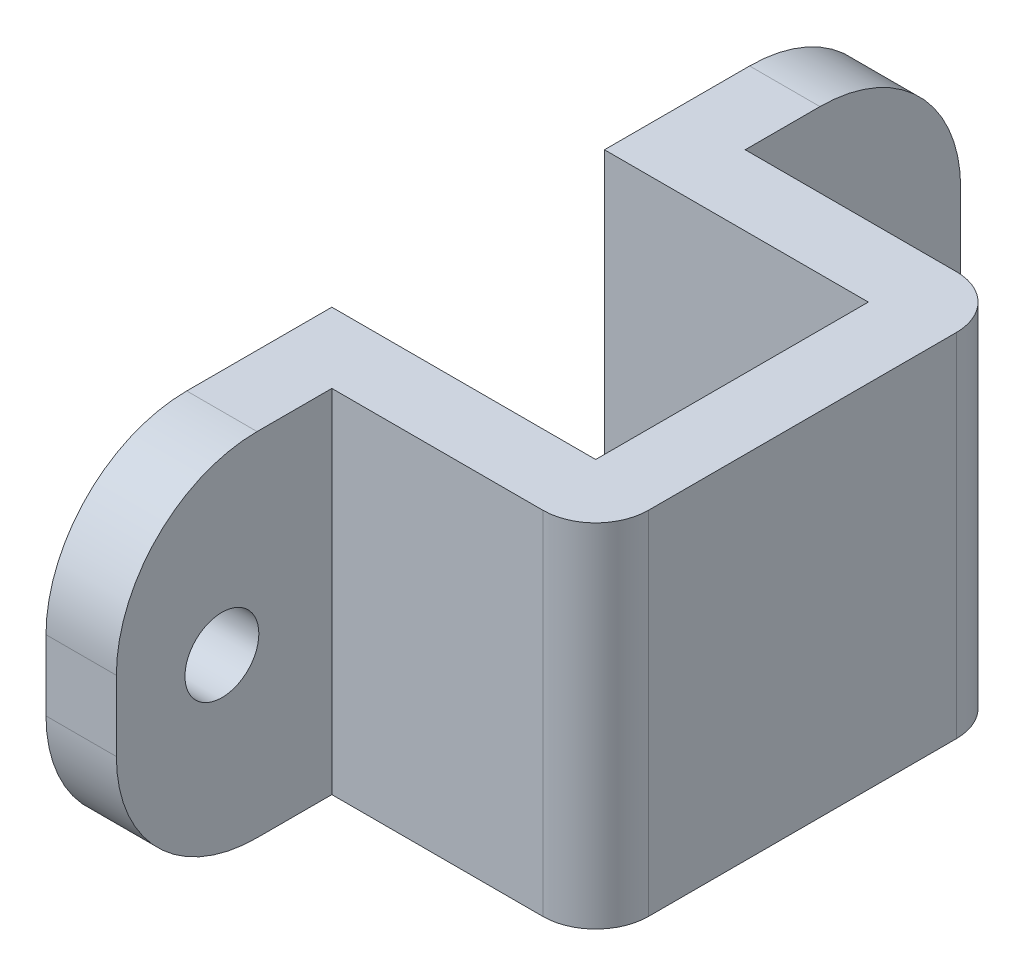
ISO-10303-21;
HEADER;
FILE_DESCRIPTION(('STEP AP214'),'2;1');
FILE_NAME('part.step','',(''),(''),'','','');
FILE_SCHEMA(('AUTOMOTIVE_DESIGN { 1 0 10303 214 1 1 1 1 }'));
ENDSEC;
DATA;
#1=APPLICATION_CONTEXT('core data for automotive mechanical design processes');
#2=APPLICATION_PROTOCOL_DEFINITION('international standard','automotive_design',2000,#1);
#3=PRODUCT_CONTEXT('',#1,'mechanical');
#4=PRODUCT('Part','Part','',(#3));
#5=PRODUCT_RELATED_PRODUCT_CATEGORY('part','',(#4));
#6=PRODUCT_DEFINITION_FORMATION('','',#4);
#7=PRODUCT_DEFINITION_CONTEXT('part definition',#1,'design');
#8=PRODUCT_DEFINITION('design','',#6,#7);
#9=PRODUCT_DEFINITION_SHAPE('','',#8);
#10=(LENGTH_UNIT() NAMED_UNIT(*) SI_UNIT(.MILLI.,.METRE.));
#11=(NAMED_UNIT(*) PLANE_ANGLE_UNIT() SI_UNIT($,.RADIAN.));
#12=(NAMED_UNIT(*) SI_UNIT($,.STERADIAN.) SOLID_ANGLE_UNIT());
#13=UNCERTAINTY_MEASURE_WITH_UNIT(LENGTH_MEASURE(1.E-05),#10,'distance_accuracy_value','');
#14=(GEOMETRIC_REPRESENTATION_CONTEXT(3) GLOBAL_UNCERTAINTY_ASSIGNED_CONTEXT((#13)) GLOBAL_UNIT_ASSIGNED_CONTEXT((#10,
#11,#12)) REPRESENTATION_CONTEXT('',''));
#15=CARTESIAN_POINT('',(0.,0.,0.));
#16=DIRECTION('',(0.,0.,1.));
#17=DIRECTION('',(1.,0.,0.));
#18=AXIS2_PLACEMENT_3D('',#15,#16,#17);
#19=CARTESIAN_POINT('',(0.,20.,-7.75));
#20=DIRECTION('',(0.,0.,-1.));
#21=DIRECTION('',(-1.,0.,0.));
#22=AXIS2_PLACEMENT_3D('',#19,#20,#21);
#23=PLANE('',#22);
#24=DIRECTION('',(1.,0.,0.));
#25=VECTOR('',#24,1.);
#26=CARTESIAN_POINT('',(0.,0.,-7.75));
#27=LINE('',#26,#25);
#28=CARTESIAN_POINT('',(-15.,0.,-7.75));
#29=VERTEX_POINT('',#28);
#30=CARTESIAN_POINT('',(0.,0.,-7.75));
#31=VERTEX_POINT('',#30);
#32=EDGE_CURVE('E188',#29,#31,#27,.T.);
#33=ORIENTED_EDGE('',*,*,#32,.T.);
#34=DIRECTION('',(0.,-1.,0.));
#35=VECTOR('',#34,1.);
#36=CARTESIAN_POINT('',(0.,20.,-7.75));
#37=LINE('',#36,#35);
#38=CARTESIAN_POINT('',(0.,20.,-7.75));
#39=VERTEX_POINT('',#38);
#40=EDGE_CURVE('E186',#39,#31,#37,.T.);
#41=ORIENTED_EDGE('',*,*,#40,.F.);
#42=DIRECTION('',(1.,0.,0.));
#43=VECTOR('',#42,1.);
#44=CARTESIAN_POINT('',(-11.,20.,-7.75));
#45=LINE('',#44,#43);
#46=CARTESIAN_POINT('',(-15.,20.,-7.75));
#47=VERTEX_POINT('',#46);
#48=EDGE_CURVE('E170',#47,#39,#45,.T.);
#49=ORIENTED_EDGE('',*,*,#48,.F.);
#50=DIRECTION('',(0.,-1.,0.));
#51=VECTOR('',#50,1.);
#52=CARTESIAN_POINT('',(-15.,20.,-7.75));
#53=LINE('',#52,#51);
#54=EDGE_CURVE('E228',#47,#29,#53,.T.);
#55=ORIENTED_EDGE('',*,*,#54,.T.);
#56=EDGE_LOOP('',(#33,#41,#49,#55));
#57=FACE_BOUND('',#56,.T.);
#58=ADVANCED_FACE('F43',(#57),#23,.F.);
#59=CARTESIAN_POINT('',(0.,20.,7.75));
#60=DIRECTION('',(1.,0.,0.));
#61=DIRECTION('',(0.,0.,-1.));
#62=AXIS2_PLACEMENT_3D('',#59,#60,#61);
#63=PLANE('',#62);
#64=DIRECTION('',(0.,0.,1.));
#65=VECTOR('',#64,1.);
#66=CARTESIAN_POINT('',(0.,0.,7.75));
#67=LINE('',#66,#65);
#68=CARTESIAN_POINT('',(0.,0.,7.75));
#69=VERTEX_POINT('',#68);
#70=EDGE_CURVE('E231',#31,#69,#67,.T.);
#71=ORIENTED_EDGE('',*,*,#70,.T.);
#72=DIRECTION('',(0.,-1.,0.));
#73=VECTOR('',#72,1.);
#74=CARTESIAN_POINT('',(0.,20.,7.75));
#75=LINE('',#74,#73);
#76=CARTESIAN_POINT('',(0.,20.,7.75));
#77=VERTEX_POINT('',#76);
#78=EDGE_CURVE('E194',#77,#69,#75,.T.);
#79=ORIENTED_EDGE('',*,*,#78,.F.);
#80=DIRECTION('',(0.,0.,1.));
#81=VECTOR('',#80,1.);
#82=CARTESIAN_POINT('',(0.,20.,7.75));
#83=LINE('',#82,#81);
#84=EDGE_CURVE('E174',#39,#77,#83,.T.);
#85=ORIENTED_EDGE('',*,*,#84,.F.);
#86=ORIENTED_EDGE('',*,*,#40,.T.);
#87=EDGE_LOOP('',(#71,#79,#85,#86));
#88=FACE_BOUND('',#87,.T.);
#89=ADVANCED_FACE('F196',(#88),#63,.F.);
#90=CARTESIAN_POINT('',(-11.,20.,7.75));
#91=DIRECTION('',(0.,0.,1.));
#92=DIRECTION('',(1.,0.,0.));
#93=AXIS2_PLACEMENT_3D('',#90,#91,#92);
#94=PLANE('',#93);
#95=DIRECTION('',(-1.,0.,0.));
#96=VECTOR('',#95,1.);
#97=CARTESIAN_POINT('',(-11.,0.,7.75));
#98=LINE('',#97,#96);
#99=CARTESIAN_POINT('',(-15.,0.,7.75));
#100=VERTEX_POINT('',#99);
#101=EDGE_CURVE('E235',#69,#100,#98,.T.);
#102=ORIENTED_EDGE('',*,*,#101,.T.);
#103=DIRECTION('',(0.,-1.,0.));
#104=VECTOR('',#103,1.);
#105=CARTESIAN_POINT('',(-15.,20.,7.75));
#106=LINE('',#105,#104);
#107=CARTESIAN_POINT('',(-15.,20.,7.75));
#108=VERTEX_POINT('',#107);
#109=EDGE_CURVE('E287',#108,#100,#106,.T.);
#110=ORIENTED_EDGE('',*,*,#109,.F.);
#111=DIRECTION('',(-1.,0.,0.));
#112=VECTOR('',#111,1.);
#113=CARTESIAN_POINT('',(0.,20.,7.75));
#114=LINE('',#113,#112);
#115=EDGE_CURVE('E200',#77,#108,#114,.T.);
#116=ORIENTED_EDGE('',*,*,#115,.F.);
#117=ORIENTED_EDGE('',*,*,#78,.T.);
#118=EDGE_LOOP('',(#102,#110,#116,#117));
#119=FACE_BOUND('',#118,.T.);
#120=ADVANCED_FACE('F411',(#119),#94,.F.);
#121=CARTESIAN_POINT('',(-15.,20.,20.));
#122=DIRECTION('',(1.,0.,0.));
#123=DIRECTION('',(0.,0.,-1.));
#124=AXIS2_PLACEMENT_3D('',#121,#122,#123);
#125=PLANE('',#124);
#126=CARTESIAN_POINT('',(-15.,10.,18.));
#127=DIRECTION('',(1.,0.,0.));
#128=DIRECTION('',(0.,0.,-1.));
#129=AXIS2_PLACEMENT_3D('',#126,#127,#128);
#130=CIRCLE('',#129,2.1);
#131=CARTESIAN_POINT('',(-15.,10.,15.9));
#132=VERTEX_POINT('',#131);
#133=EDGE_CURVE('E232',#132,#132,#130,.T.);
#134=ORIENTED_EDGE('',*,*,#133,.T.);
#135=EDGE_LOOP('',(#134));
#136=FACE_BOUND('',#135,.T.);
#137=DIRECTION('',(0.,0.,1.));
#138=VECTOR('',#137,1.);
#139=CARTESIAN_POINT('',(-15.,0.,20.));
#140=LINE('',#139,#138);
#141=CARTESIAN_POINT('',(-15.,0.,16.));
#142=VERTEX_POINT('',#141);
#143=EDGE_CURVE('E239',#100,#142,#140,.T.);
#144=ORIENTED_EDGE('',*,*,#143,.T.);
#145=CARTESIAN_POINT('',(-15.,8.,16.));
#146=DIRECTION('',(1.,0.,0.));
#147=DIRECTION('',(0.,0.,-1.));
#148=AXIS2_PLACEMENT_3D('',#145,#146,#147);
#149=CIRCLE('',#148,8.);
#150=CARTESIAN_POINT('',(-15.,8.,24.));
#151=VERTEX_POINT('',#150);
#152=EDGE_CURVE('E345',#142,#151,#149,.F.);
#153=ORIENTED_EDGE('',*,*,#152,.T.);
#154=DIRECTION('',(0.,-1.,0.));
#155=VECTOR('',#154,1.);
#156=CARTESIAN_POINT('',(-15.,20.,24.));
#157=LINE('',#156,#155);
#158=CARTESIAN_POINT('',(-15.,12.,24.));
#159=VERTEX_POINT('',#158);
#160=EDGE_CURVE('E283',#159,#151,#157,.T.);
#161=ORIENTED_EDGE('',*,*,#160,.F.);
#162=CARTESIAN_POINT('',(-15.,12.,16.));
#163=DIRECTION('',(1.,0.,0.));
#164=DIRECTION('',(0.,0.,-1.));
#165=AXIS2_PLACEMENT_3D('',#162,#163,#164);
#166=CIRCLE('',#165,8.);
#167=CARTESIAN_POINT('',(-15.,20.,16.));
#168=VERTEX_POINT('',#167);
#169=EDGE_CURVE('E342',#159,#168,#166,.F.);
#170=ORIENTED_EDGE('',*,*,#169,.T.);
#171=DIRECTION('',(0.,0.,1.));
#172=VECTOR('',#171,1.);
#173=CARTESIAN_POINT('',(-15.,20.,7.75));
#174=LINE('',#173,#172);
#175=EDGE_CURVE('E203',#108,#168,#174,.T.);
#176=ORIENTED_EDGE('',*,*,#175,.F.);
#177=ORIENTED_EDGE('',*,*,#109,.T.);
#178=EDGE_LOOP('',(#144,#153,#161,#170,#176,#177));
#179=FACE_BOUND('',#178,.T.);
#180=ADVANCED_FACE('F399',(#136,#179),#125,.F.);
#181=CARTESIAN_POINT('',(-11.,20.,24.));
#182=DIRECTION('',(0.,0.,-1.));
#183=DIRECTION('',(-1.,0.,0.));
#184=AXIS2_PLACEMENT_3D('',#181,#182,#183);
#185=PLANE('',#184);
#186=ORIENTED_EDGE('',*,*,#160,.T.);
#187=DIRECTION('',(1.,0.,0.));
#188=VECTOR('',#187,1.);
#189=CARTESIAN_POINT('',(-11.,8.,24.));
#190=LINE('',#189,#188);
#191=CARTESIAN_POINT('',(-11.,8.,24.));
#192=VERTEX_POINT('',#191);
#193=EDGE_CURVE('E332',#151,#192,#190,.T.);
#194=ORIENTED_EDGE('',*,*,#193,.T.);
#195=DIRECTION('',(0.,-1.,0.));
#196=VECTOR('',#195,1.);
#197=CARTESIAN_POINT('',(-11.,20.,24.));
#198=LINE('',#197,#196);
#199=CARTESIAN_POINT('',(-11.,12.,24.));
#200=VERTEX_POINT('',#199);
#201=EDGE_CURVE('E279',#200,#192,#198,.T.);
#202=ORIENTED_EDGE('',*,*,#201,.F.);
#203=DIRECTION('',(1.,0.,0.));
#204=VECTOR('',#203,1.);
#205=CARTESIAN_POINT('',(-15.,12.,24.));
#206=LINE('',#205,#204);
#207=EDGE_CURVE('E329',#200,#159,#206,.F.);
#208=ORIENTED_EDGE('',*,*,#207,.T.);
#209=EDGE_LOOP('',(#186,#194,#202,#208));
#210=FACE_BOUND('',#209,.T.);
#211=ADVANCED_FACE('F402',(#210),#185,.F.);
#212=CARTESIAN_POINT('',(-11.,20.,11.75));
#213=DIRECTION('',(-1.,0.,0.));
#214=DIRECTION('',(0.,0.,1.));
#215=AXIS2_PLACEMENT_3D('',#212,#213,#214);
#216=PLANE('',#215);
#217=CARTESIAN_POINT('',(-11.,10.,18.));
#218=DIRECTION('',(1.,0.,0.));
#219=DIRECTION('',(0.,0.,-1.));
#220=AXIS2_PLACEMENT_3D('',#217,#218,#219);
#221=CIRCLE('',#220,2.1);
#222=CARTESIAN_POINT('',(-11.,10.,15.9));
#223=VERTEX_POINT('',#222);
#224=EDGE_CURVE('E297',#223,#223,#221,.T.);
#225=ORIENTED_EDGE('',*,*,#224,.F.);
#226=EDGE_LOOP('',(#225));
#227=FACE_BOUND('',#226,.T.);
#228=ORIENTED_EDGE('',*,*,#201,.T.);
#229=CARTESIAN_POINT('',(-11.,8.,16.));
#230=DIRECTION('',(-1.,0.,0.));
#231=DIRECTION('',(0.,0.,1.));
#232=AXIS2_PLACEMENT_3D('',#229,#230,#231);
#233=CIRCLE('',#232,8.);
#234=CARTESIAN_POINT('',(-11.,0.,16.));
#235=VERTEX_POINT('',#234);
#236=EDGE_CURVE('E339',#192,#235,#233,.F.);
#237=ORIENTED_EDGE('',*,*,#236,.T.);
#238=DIRECTION('',(0.,0.,-1.));
#239=VECTOR('',#238,1.);
#240=CARTESIAN_POINT('',(-11.,0.,11.75));
#241=LINE('',#240,#239);
#242=CARTESIAN_POINT('',(-11.,0.,11.75));
#243=VERTEX_POINT('',#242);
#244=EDGE_CURVE('E243',#235,#243,#241,.T.);
#245=ORIENTED_EDGE('',*,*,#244,.T.);
#246=DIRECTION('',(0.,-1.,0.));
#247=VECTOR('',#246,1.);
#248=CARTESIAN_POINT('',(-11.,20.,11.75));
#249=LINE('',#248,#247);
#250=CARTESIAN_POINT('',(-11.,20.,11.75));
#251=VERTEX_POINT('',#250);
#252=EDGE_CURVE('E275',#251,#243,#249,.T.);
#253=ORIENTED_EDGE('',*,*,#252,.F.);
#254=DIRECTION('',(0.,0.,-1.));
#255=VECTOR('',#254,1.);
#256=CARTESIAN_POINT('',(-11.,20.,20.));
#257=LINE('',#256,#255);
#258=CARTESIAN_POINT('',(-11.,20.,16.));
#259=VERTEX_POINT('',#258);
#260=EDGE_CURVE('E210',#259,#251,#257,.T.);
#261=ORIENTED_EDGE('',*,*,#260,.F.);
#262=CARTESIAN_POINT('',(-11.,12.,16.));
#263=DIRECTION('',(-1.,0.,0.));
#264=DIRECTION('',(0.,0.,1.));
#265=AXIS2_PLACEMENT_3D('',#262,#263,#264);
#266=CIRCLE('',#265,8.);
#267=EDGE_CURVE('E336',#259,#200,#266,.F.);
#268=ORIENTED_EDGE('',*,*,#267,.T.);
#269=EDGE_LOOP('',(#228,#237,#245,#253,#261,#268));
#270=FACE_BOUND('',#269,.T.);
#271=ADVANCED_FACE('F391',(#227,#270),#216,.F.);
#272=CARTESIAN_POINT('',(4.,20.,11.75));
#273=DIRECTION('',(0.,0.,-1.));
#274=DIRECTION('',(-1.,0.,0.));
#275=AXIS2_PLACEMENT_3D('',#272,#273,#274);
#276=PLANE('',#275);
#277=DIRECTION('',(1.,0.,0.));
#278=VECTOR('',#277,1.);
#279=CARTESIAN_POINT('',(4.,0.,11.75));
#280=LINE('',#279,#278);
#281=CARTESIAN_POINT('',(1.,0.,11.75));
#282=VERTEX_POINT('',#281);
#283=EDGE_CURVE('E246',#243,#282,#280,.T.);
#284=ORIENTED_EDGE('',*,*,#283,.T.);
#285=DIRECTION('',(0.,-1.,0.));
#286=VECTOR('',#285,1.);
#287=CARTESIAN_POINT('',(1.,20.,11.75));
#288=LINE('',#287,#286);
#289=CARTESIAN_POINT('',(0.999999999999999,20.,11.75));
#290=VERTEX_POINT('',#289);
#291=EDGE_CURVE('E11',#282,#290,#288,.F.);
#292=ORIENTED_EDGE('',*,*,#291,.T.);
#293=DIRECTION('',(1.,0.,0.));
#294=VECTOR('',#293,1.);
#295=CARTESIAN_POINT('',(-7.,20.,11.75));
#296=LINE('',#295,#294);
#297=EDGE_CURVE('E213',#251,#290,#296,.T.);
#298=ORIENTED_EDGE('',*,*,#297,.F.);
#299=ORIENTED_EDGE('',*,*,#252,.T.);
#300=EDGE_LOOP('',(#284,#292,#298,#299));
#301=FACE_BOUND('',#300,.T.);
#302=ADVANCED_FACE('F387',(#301),#276,.F.);
#303=CARTESIAN_POINT('',(4.,20.,11.75));
#304=DIRECTION('',(-1.,0.,0.));
#305=DIRECTION('',(0.,0.,1.));
#306=AXIS2_PLACEMENT_3D('',#303,#304,#305);
#307=PLANE('',#306);
#308=DIRECTION('',(0.,0.,-1.));
#309=VECTOR('',#308,1.);
#310=CARTESIAN_POINT('',(4.,0.,11.75));
#311=LINE('',#310,#309);
#312=CARTESIAN_POINT('',(4.,0.,8.75));
#313=VERTEX_POINT('',#312);
#314=CARTESIAN_POINT('',(4.,0.,-8.75));
#315=VERTEX_POINT('',#314);
#316=EDGE_CURVE('E249',#313,#315,#311,.T.);
#317=ORIENTED_EDGE('',*,*,#316,.T.);
#318=DIRECTION('',(0.,-1.,0.));
#319=VECTOR('',#318,1.);
#320=CARTESIAN_POINT('',(4.,20.,-8.75));
#321=LINE('',#320,#319);
#322=CARTESIAN_POINT('',(4.,20.,-8.75));
#323=VERTEX_POINT('',#322);
#324=EDGE_CURVE('E65',#315,#323,#321,.F.);
#325=ORIENTED_EDGE('',*,*,#324,.T.);
#326=DIRECTION('',(0.,0.,-1.));
#327=VECTOR('',#326,1.);
#328=CARTESIAN_POINT('',(4.,20.,11.75));
#329=LINE('',#328,#327);
#330=CARTESIAN_POINT('',(4.,20.,8.75));
#331=VERTEX_POINT('',#330);
#332=EDGE_CURVE('E216',#331,#323,#329,.T.);
#333=ORIENTED_EDGE('',*,*,#332,.F.);
#334=DIRECTION('',(0.,-1.,0.));
#335=VECTOR('',#334,1.);
#336=CARTESIAN_POINT('',(4.,20.,8.75));
#337=LINE('',#336,#335);
#338=EDGE_CURVE('E358',#331,#313,#337,.T.);
#339=ORIENTED_EDGE('',*,*,#338,.T.);
#340=EDGE_LOOP('',(#317,#325,#333,#339));
#341=FACE_BOUND('',#340,.T.);
#342=ADVANCED_FACE('F381',(#341),#307,.F.);
#343=CARTESIAN_POINT('',(-7.,20.,-11.75));
#344=DIRECTION('',(0.,0.,1.));
#345=DIRECTION('',(1.,0.,0.));
#346=AXIS2_PLACEMENT_3D('',#343,#344,#345);
#347=PLANE('',#346);
#348=DIRECTION('',(-1.,0.,0.));
#349=VECTOR('',#348,1.);
#350=CARTESIAN_POINT('',(4.,20.,-11.75));
#351=LINE('',#350,#349);
#352=CARTESIAN_POINT('',(1.,20.,-11.75));
#353=VERTEX_POINT('',#352);
#354=CARTESIAN_POINT('',(-11.,20.,-11.75));
#355=VERTEX_POINT('',#354);
#356=EDGE_CURVE('E219',#353,#355,#351,.T.);
#357=ORIENTED_EDGE('',*,*,#356,.F.);
#358=DIRECTION('',(0.,-1.,0.));
#359=VECTOR('',#358,1.);
#360=CARTESIAN_POINT('',(1.,20.,-11.75));
#361=LINE('',#360,#359);
#362=CARTESIAN_POINT('',(1.,0.,-11.75));
#363=VERTEX_POINT('',#362);
#364=EDGE_CURVE('E348',#353,#363,#361,.T.);
#365=ORIENTED_EDGE('',*,*,#364,.T.);
#366=DIRECTION('',(-1.,0.,0.));
#367=VECTOR('',#366,1.);
#368=CARTESIAN_POINT('',(-7.,0.,-11.75));
#369=LINE('',#368,#367);
#370=CARTESIAN_POINT('',(-11.,0.,-11.75));
#371=VERTEX_POINT('',#370);
#372=EDGE_CURVE('E252',#363,#371,#369,.T.);
#373=ORIENTED_EDGE('',*,*,#372,.T.);
#374=DIRECTION('',(0.,-1.,0.));
#375=VECTOR('',#374,1.);
#376=CARTESIAN_POINT('',(-11.,20.,-11.75));
#377=LINE('',#376,#375);
#378=EDGE_CURVE('E271',#355,#371,#377,.T.);
#379=ORIENTED_EDGE('',*,*,#378,.F.);
#380=EDGE_LOOP('',(#357,#365,#373,#379));
#381=FACE_BOUND('',#380,.T.);
#382=ADVANCED_FACE('F373',(#381),#347,.F.);
#383=CARTESIAN_POINT('',(-11.,20.,-20.));
#384=DIRECTION('',(-1.,0.,0.));
#385=DIRECTION('',(0.,0.,1.));
#386=AXIS2_PLACEMENT_3D('',#383,#384,#385);
#387=PLANE('',#386);
#388=CARTESIAN_POINT('',(-11.,10.,-18.));
#389=DIRECTION('',(1.,0.,0.));
#390=DIRECTION('',(0.,0.,1.));
#391=AXIS2_PLACEMENT_3D('',#388,#389,#390);
#392=CIRCLE('',#391,2.1);
#393=CARTESIAN_POINT('',(-11.,10.,-15.9));
#394=VERTEX_POINT('',#393);
#395=EDGE_CURVE('E484',#394,#394,#392,.T.);
#396=ORIENTED_EDGE('',*,*,#395,.F.);
#397=EDGE_LOOP('',(#396));
#398=FACE_BOUND('',#397,.T.);
#399=DIRECTION('',(0.,-1.,0.));
#400=VECTOR('',#399,1.);
#401=CARTESIAN_POINT('',(-11.,20.,-24.));
#402=LINE('',#401,#400);
#403=CARTESIAN_POINT('',(-11.,12.,-24.));
#404=VERTEX_POINT('',#403);
#405=CARTESIAN_POINT('',(-11.,8.,-24.));
#406=VERTEX_POINT('',#405);
#407=EDGE_CURVE('E267',#404,#406,#402,.T.);
#408=ORIENTED_EDGE('',*,*,#407,.F.);
#409=CARTESIAN_POINT('',(-11.,12.,-16.));
#410=DIRECTION('',(-1.,0.,0.));
#411=DIRECTION('',(0.,0.,1.));
#412=AXIS2_PLACEMENT_3D('',#409,#410,#411);
#413=CIRCLE('',#412,8.);
#414=CARTESIAN_POINT('',(-11.,20.,-16.));
#415=VERTEX_POINT('',#414);
#416=EDGE_CURVE('E320',#404,#415,#413,.F.);
#417=ORIENTED_EDGE('',*,*,#416,.T.);
#418=DIRECTION('',(0.,0.,-1.));
#419=VECTOR('',#418,1.);
#420=CARTESIAN_POINT('',(-11.,20.,-11.75));
#421=LINE('',#420,#419);
#422=EDGE_CURVE('E222',#355,#415,#421,.T.);
#423=ORIENTED_EDGE('',*,*,#422,.F.);
#424=ORIENTED_EDGE('',*,*,#378,.T.);
#425=DIRECTION('',(0.,0.,-1.));
#426=VECTOR('',#425,1.);
#427=CARTESIAN_POINT('',(-11.,0.,-20.));
#428=LINE('',#427,#426);
#429=CARTESIAN_POINT('',(-11.,0.,-16.));
#430=VERTEX_POINT('',#429);
#431=EDGE_CURVE('E255',#371,#430,#428,.T.);
#432=ORIENTED_EDGE('',*,*,#431,.T.);
#433=CARTESIAN_POINT('',(-11.,8.,-16.));
#434=DIRECTION('',(-1.,0.,0.));
#435=DIRECTION('',(0.,0.,1.));
#436=AXIS2_PLACEMENT_3D('',#433,#434,#435);
#437=CIRCLE('',#436,8.);
#438=EDGE_CURVE('E317',#430,#406,#437,.F.);
#439=ORIENTED_EDGE('',*,*,#438,.T.);
#440=EDGE_LOOP('',(#408,#417,#423,#424,#432,#439));
#441=FACE_BOUND('',#440,.T.);
#442=ADVANCED_FACE('F427',(#398,#441),#387,.F.);
#443=CARTESIAN_POINT('',(-11.,20.,-24.));
#444=DIRECTION('',(0.,0.,1.));
#445=DIRECTION('',(1.,0.,0.));
#446=AXIS2_PLACEMENT_3D('',#443,#444,#445);
#447=PLANE('',#446);
#448=DIRECTION('',(0.,-1.,0.));
#449=VECTOR('',#448,1.);
#450=CARTESIAN_POINT('',(-15.,20.,-24.));
#451=LINE('',#450,#449);
#452=CARTESIAN_POINT('',(-15.,12.,-24.));
#453=VERTEX_POINT('',#452);
#454=CARTESIAN_POINT('',(-15.,8.,-24.));
#455=VERTEX_POINT('',#454);
#456=EDGE_CURVE('E263',#453,#455,#451,.T.);
#457=ORIENTED_EDGE('',*,*,#456,.F.);
#458=DIRECTION('',(-1.,0.,0.));
#459=VECTOR('',#458,1.);
#460=CARTESIAN_POINT('',(-11.,12.,-24.));
#461=LINE('',#460,#459);
#462=EDGE_CURVE('E314',#453,#404,#461,.F.);
#463=ORIENTED_EDGE('',*,*,#462,.T.);
#464=ORIENTED_EDGE('',*,*,#407,.T.);
#465=DIRECTION('',(-1.,0.,0.));
#466=VECTOR('',#465,1.);
#467=CARTESIAN_POINT('',(-11.,8.,-24.));
#468=LINE('',#467,#466);
#469=EDGE_CURVE('E310',#406,#455,#468,.T.);
#470=ORIENTED_EDGE('',*,*,#469,.T.);
#471=EDGE_LOOP('',(#457,#463,#464,#470));
#472=FACE_BOUND('',#471,.T.);
#473=ADVANCED_FACE('F422',(#472),#447,.F.);
#474=CARTESIAN_POINT('',(-15.,20.,-20.));
#475=DIRECTION('',(1.,0.,0.));
#476=DIRECTION('',(0.,0.,-1.));
#477=AXIS2_PLACEMENT_3D('',#474,#475,#476);
#478=PLANE('',#477);
#479=CARTESIAN_POINT('',(-15.,10.,-18.));
#480=DIRECTION('',(1.,0.,0.));
#481=DIRECTION('',(0.,0.,-1.));
#482=AXIS2_PLACEMENT_3D('',#479,#480,#481);
#483=CIRCLE('',#482,2.1);
#484=CARTESIAN_POINT('',(-15.,10.,-20.1));
#485=VERTEX_POINT('',#484);
#486=EDGE_CURVE('E293',#485,#485,#483,.T.);
#487=ORIENTED_EDGE('',*,*,#486,.T.);
#488=EDGE_LOOP('',(#487));
#489=FACE_BOUND('',#488,.T.);
#490=DIRECTION('',(0.,0.,1.));
#491=VECTOR('',#490,1.);
#492=CARTESIAN_POINT('',(-15.,20.,-20.));
#493=LINE('',#492,#491);
#494=CARTESIAN_POINT('',(-15.,20.,-16.));
#495=VERTEX_POINT('',#494);
#496=EDGE_CURVE('E178',#495,#47,#493,.T.);
#497=ORIENTED_EDGE('',*,*,#496,.F.);
#498=CARTESIAN_POINT('',(-15.,12.,-16.));
#499=DIRECTION('',(1.,0.,0.));
#500=DIRECTION('',(0.,0.,-1.));
#501=AXIS2_PLACEMENT_3D('',#498,#499,#500);
#502=CIRCLE('',#501,8.);
#503=EDGE_CURVE('E307',#495,#453,#502,.F.);
#504=ORIENTED_EDGE('',*,*,#503,.T.);
#505=ORIENTED_EDGE('',*,*,#456,.T.);
#506=CARTESIAN_POINT('',(-15.,8.,-16.));
#507=DIRECTION('',(1.,0.,0.));
#508=DIRECTION('',(0.,0.,-1.));
#509=AXIS2_PLACEMENT_3D('',#506,#507,#508);
#510=CIRCLE('',#509,8.);
#511=CARTESIAN_POINT('',(-15.,0.,-16.));
#512=VERTEX_POINT('',#511);
#513=EDGE_CURVE('E304',#455,#512,#510,.F.);
#514=ORIENTED_EDGE('',*,*,#513,.T.);
#515=DIRECTION('',(0.,0.,1.));
#516=VECTOR('',#515,1.);
#517=CARTESIAN_POINT('',(-15.,0.,-20.));
#518=LINE('',#517,#516);
#519=EDGE_CURVE('E183',#512,#29,#518,.T.);
#520=ORIENTED_EDGE('',*,*,#519,.T.);
#521=ORIENTED_EDGE('',*,*,#54,.F.);
#522=EDGE_LOOP('',(#497,#504,#505,#514,#520,#521));
#523=FACE_BOUND('',#522,.T.);
#524=ADVANCED_FACE('F415',(#489,#523),#478,.F.);
#525=CARTESIAN_POINT('',(0.,20.,0.));
#526=DIRECTION('',(0.,1.,0.));
#527=DIRECTION('',(0.,0.,1.));
#528=AXIS2_PLACEMENT_3D('',#525,#526,#527);
#529=PLANE('',#528);
#530=ORIENTED_EDGE('',*,*,#332,.T.);
#531=CARTESIAN_POINT('',(1.,20.,-8.75));
#532=DIRECTION('',(0.,1.,0.));
#533=DIRECTION('',(0.,0.,1.));
#534=AXIS2_PLACEMENT_3D('',#531,#532,#533);
#535=CIRCLE('',#534,3.);
#536=EDGE_CURVE('E52',#323,#353,#535,.T.);
#537=ORIENTED_EDGE('',*,*,#536,.T.);
#538=ORIENTED_EDGE('',*,*,#356,.T.);
#539=ORIENTED_EDGE('',*,*,#422,.T.);
#540=DIRECTION('',(-1.,0.,0.));
#541=VECTOR('',#540,1.);
#542=CARTESIAN_POINT('',(-15.,20.,-16.));
#543=LINE('',#542,#541);
#544=EDGE_CURVE('E301',#415,#495,#543,.T.);
#545=ORIENTED_EDGE('',*,*,#544,.T.);
#546=ORIENTED_EDGE('',*,*,#496,.T.);
#547=ORIENTED_EDGE('',*,*,#48,.T.);
#548=ORIENTED_EDGE('',*,*,#84,.T.);
#549=ORIENTED_EDGE('',*,*,#115,.T.);
#550=ORIENTED_EDGE('',*,*,#175,.T.);
#551=DIRECTION('',(1.,0.,0.));
#552=VECTOR('',#551,1.);
#553=CARTESIAN_POINT('',(-11.,20.,16.));
#554=LINE('',#553,#552);
#555=EDGE_CURVE('E193',#168,#259,#554,.T.);
#556=ORIENTED_EDGE('',*,*,#555,.T.);
#557=ORIENTED_EDGE('',*,*,#260,.T.);
#558=ORIENTED_EDGE('',*,*,#297,.T.);
#559=CARTESIAN_POINT('',(1.,20.,8.75));
#560=DIRECTION('',(0.,1.,0.));
#561=DIRECTION('',(0.,0.,1.));
#562=AXIS2_PLACEMENT_3D('',#559,#560,#561);
#563=CIRCLE('',#562,3.);
#564=EDGE_CURVE('E364',#290,#331,#563,.T.);
#565=ORIENTED_EDGE('',*,*,#564,.T.);
#566=EDGE_LOOP('',(#530,#537,#538,#539,#545,#546,#547,#548,#549,#550,#556,#557,#558,#565));
#567=FACE_BOUND('',#566,.T.);
#568=ADVANCED_FACE('F172',(#567),#529,.T.);
#569=CARTESIAN_POINT('',(0.,0.,0.));
#570=DIRECTION('',(0.,1.,0.));
#571=DIRECTION('',(0.,0.,1.));
#572=AXIS2_PLACEMENT_3D('',#569,#570,#571);
#573=PLANE('',#572);
#574=ORIENTED_EDGE('',*,*,#372,.F.);
#575=CARTESIAN_POINT('',(1.,0.,-8.75));
#576=DIRECTION('',(0.,1.,0.));
#577=DIRECTION('',(0.,0.,1.));
#578=AXIS2_PLACEMENT_3D('',#575,#576,#577);
#579=CIRCLE('',#578,3.);
#580=EDGE_CURVE('E355',#363,#315,#579,.F.);
#581=ORIENTED_EDGE('',*,*,#580,.T.);
#582=ORIENTED_EDGE('',*,*,#316,.F.);
#583=CARTESIAN_POINT('',(1.,0.,8.75));
#584=DIRECTION('',(0.,1.,0.));
#585=DIRECTION('',(0.,0.,1.));
#586=AXIS2_PLACEMENT_3D('',#583,#584,#585);
#587=CIRCLE('',#586,3.);
#588=EDGE_CURVE('E352',#313,#282,#587,.F.);
#589=ORIENTED_EDGE('',*,*,#588,.T.);
#590=ORIENTED_EDGE('',*,*,#283,.F.);
#591=ORIENTED_EDGE('',*,*,#244,.F.);
#592=DIRECTION('',(1.,0.,0.));
#593=VECTOR('',#592,1.);
#594=CARTESIAN_POINT('',(0.,0.,16.));
#595=LINE('',#594,#593);
#596=EDGE_CURVE('E323',#235,#142,#595,.F.);
#597=ORIENTED_EDGE('',*,*,#596,.T.);
#598=ORIENTED_EDGE('',*,*,#143,.F.);
#599=ORIENTED_EDGE('',*,*,#101,.F.);
#600=ORIENTED_EDGE('',*,*,#70,.F.);
#601=ORIENTED_EDGE('',*,*,#32,.F.);
#602=ORIENTED_EDGE('',*,*,#519,.F.);
#603=DIRECTION('',(-1.,0.,0.));
#604=VECTOR('',#603,1.);
#605=CARTESIAN_POINT('',(0.,0.,-16.));
#606=LINE('',#605,#604);
#607=EDGE_CURVE('E326',#512,#430,#606,.F.);
#608=ORIENTED_EDGE('',*,*,#607,.T.);
#609=ORIENTED_EDGE('',*,*,#431,.F.);
#610=EDGE_LOOP('',(#574,#581,#582,#589,#590,#591,#597,#598,#599,#600,#601,#602,#608,#609));
#611=FACE_BOUND('',#610,.T.);
#612=ADVANCED_FACE('F379',(#611),#573,.F.);
#613=CARTESIAN_POINT('',(-21.,10.,-18.));
#614=DIRECTION('',(1.,0.,0.));
#615=DIRECTION('',(0.,0.,-1.));
#616=AXIS2_PLACEMENT_3D('',#613,#614,#615);
#617=CYLINDRICAL_SURFACE('',#616,2.1);
#618=ORIENTED_EDGE('',*,*,#395,.T.);
#619=EDGE_LOOP('',(#618));
#620=FACE_BOUND('',#619,.T.);
#621=ORIENTED_EDGE('',*,*,#486,.F.);
#622=EDGE_LOOP('',(#621));
#623=FACE_BOUND('',#622,.T.);
#624=ADVANCED_FACE('F439',(#620,#623),#617,.F.);
#625=CARTESIAN_POINT('',(-21.,10.,18.));
#626=DIRECTION('',(1.,0.,0.));
#627=DIRECTION('',(0.,0.,-1.));
#628=AXIS2_PLACEMENT_3D('',#625,#626,#627);
#629=CYLINDRICAL_SURFACE('',#628,2.1);
#630=ORIENTED_EDGE('',*,*,#224,.T.);
#631=EDGE_LOOP('',(#630));
#632=FACE_BOUND('',#631,.T.);
#633=ORIENTED_EDGE('',*,*,#133,.F.);
#634=EDGE_LOOP('',(#633));
#635=FACE_BOUND('',#634,.T.);
#636=ADVANCED_FACE('F432',(#632,#635),#629,.F.);
#637=CARTESIAN_POINT('',(0.,12.,-16.));
#638=DIRECTION('',(1.,0.,0.));
#639=DIRECTION('',(0.,0.,-1.));
#640=AXIS2_PLACEMENT_3D('',#637,#638,#639);
#641=CYLINDRICAL_SURFACE('',#640,8.);
#642=ORIENTED_EDGE('',*,*,#416,.F.);
#643=ORIENTED_EDGE('',*,*,#462,.F.);
#644=ORIENTED_EDGE('',*,*,#503,.F.);
#645=ORIENTED_EDGE('',*,*,#544,.F.);
#646=EDGE_LOOP('',(#642,#643,#644,#645));
#647=FACE_BOUND('',#646,.T.);
#648=ADVANCED_FACE('F430',(#647),#641,.T.);
#649=CARTESIAN_POINT('',(-11.,8.,-16.));
#650=DIRECTION('',(-1.,0.,0.));
#651=DIRECTION('',(0.,0.,1.));
#652=AXIS2_PLACEMENT_3D('',#649,#650,#651);
#653=CYLINDRICAL_SURFACE('',#652,8.);
#654=ORIENTED_EDGE('',*,*,#438,.F.);
#655=ORIENTED_EDGE('',*,*,#607,.F.);
#656=ORIENTED_EDGE('',*,*,#513,.F.);
#657=ORIENTED_EDGE('',*,*,#469,.F.);
#658=EDGE_LOOP('',(#654,#655,#656,#657));
#659=FACE_BOUND('',#658,.T.);
#660=ADVANCED_FACE('F420',(#659),#653,.T.);
#661=CARTESIAN_POINT('',(-11.,8.,16.));
#662=DIRECTION('',(1.,0.,0.));
#663=DIRECTION('',(0.,0.,-1.));
#664=AXIS2_PLACEMENT_3D('',#661,#662,#663);
#665=CYLINDRICAL_SURFACE('',#664,8.);
#666=ORIENTED_EDGE('',*,*,#152,.F.);
#667=ORIENTED_EDGE('',*,*,#596,.F.);
#668=ORIENTED_EDGE('',*,*,#236,.F.);
#669=ORIENTED_EDGE('',*,*,#193,.F.);
#670=EDGE_LOOP('',(#666,#667,#668,#669));
#671=FACE_BOUND('',#670,.T.);
#672=ADVANCED_FACE('F395',(#671),#665,.T.);
#673=CARTESIAN_POINT('',(0.,12.,16.));
#674=DIRECTION('',(-1.,0.,0.));
#675=DIRECTION('',(0.,0.,1.));
#676=AXIS2_PLACEMENT_3D('',#673,#674,#675);
#677=CYLINDRICAL_SURFACE('',#676,8.);
#678=ORIENTED_EDGE('',*,*,#169,.F.);
#679=ORIENTED_EDGE('',*,*,#207,.F.);
#680=ORIENTED_EDGE('',*,*,#267,.F.);
#681=ORIENTED_EDGE('',*,*,#555,.F.);
#682=EDGE_LOOP('',(#678,#679,#680,#681));
#683=FACE_BOUND('',#682,.T.);
#684=ADVANCED_FACE('F406',(#683),#677,.T.);
#685=CARTESIAN_POINT('',(1.,20.,-8.75));
#686=DIRECTION('',(0.,-1.,0.));
#687=DIRECTION('',(0.,0.,-1.));
#688=AXIS2_PLACEMENT_3D('',#685,#686,#687);
#689=CYLINDRICAL_SURFACE('',#688,3.);
#690=ORIENTED_EDGE('',*,*,#536,.F.);
#691=ORIENTED_EDGE('',*,*,#324,.F.);
#692=ORIENTED_EDGE('',*,*,#580,.F.);
#693=ORIENTED_EDGE('',*,*,#364,.F.);
#694=EDGE_LOOP('',(#690,#691,#692,#693));
#695=FACE_BOUND('',#694,.T.);
#696=ADVANCED_FACE('F376',(#695),#689,.T.);
#697=CARTESIAN_POINT('',(1.,20.,8.75));
#698=DIRECTION('',(0.,-1.,0.));
#699=DIRECTION('',(0.,0.,-1.));
#700=AXIS2_PLACEMENT_3D('',#697,#698,#699);
#701=CYLINDRICAL_SURFACE('',#700,3.);
#702=ORIENTED_EDGE('',*,*,#564,.F.);
#703=ORIENTED_EDGE('',*,*,#291,.F.);
#704=ORIENTED_EDGE('',*,*,#588,.F.);
#705=ORIENTED_EDGE('',*,*,#338,.F.);
#706=EDGE_LOOP('',(#702,#703,#704,#705));
#707=FACE_BOUND('',#706,.T.);
#708=ADVANCED_FACE('F45',(#707),#701,.T.);
#709=CLOSED_SHELL('',(#58,#89,#120,#180,#211,#271,#302,#342,#382,#442,#473,#524,#568,#612,#624,
#636,#648,#660,#672,#684,#696,#708));
#710=MANIFOLD_SOLID_BREP('B2',#709);
#711=ADVANCED_BREP_SHAPE_REPRESENTATION('',(#18,#710),#14);
#712=SHAPE_DEFINITION_REPRESENTATION(#9,#711);
ENDSEC;
END-ISO-10303-21;
